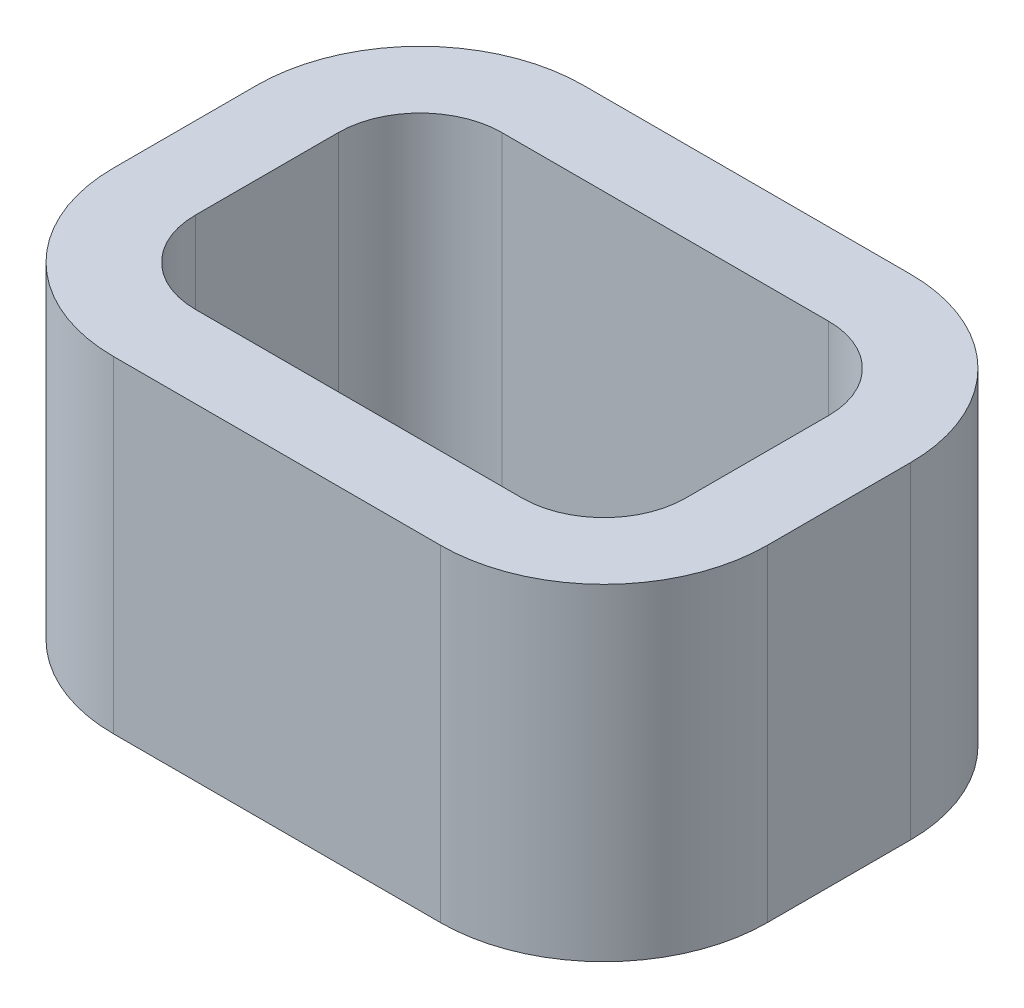
ISO-10303-21;
HEADER;
FILE_DESCRIPTION(('STEP AP214'),'2;1');
FILE_NAME('part.step','',(''),(''),'','','');
FILE_SCHEMA(('AUTOMOTIVE_DESIGN { 1 0 10303 214 1 1 1 1 }'));
ENDSEC;
DATA;
#1=APPLICATION_CONTEXT('core data for automotive mechanical design processes');
#2=APPLICATION_PROTOCOL_DEFINITION('international standard','automotive_design',2000,#1);
#3=PRODUCT_CONTEXT('',#1,'mechanical');
#4=PRODUCT('Part','Part','',(#3));
#5=PRODUCT_RELATED_PRODUCT_CATEGORY('part','',(#4));
#6=PRODUCT_DEFINITION_FORMATION('','',#4);
#7=PRODUCT_DEFINITION_CONTEXT('part definition',#1,'design');
#8=PRODUCT_DEFINITION('design','',#6,#7);
#9=PRODUCT_DEFINITION_SHAPE('','',#8);
#10=(LENGTH_UNIT() NAMED_UNIT(*) SI_UNIT(.MILLI.,.METRE.));
#11=(NAMED_UNIT(*) PLANE_ANGLE_UNIT() SI_UNIT($,.RADIAN.));
#12=(NAMED_UNIT(*) SI_UNIT($,.STERADIAN.) SOLID_ANGLE_UNIT());
#13=UNCERTAINTY_MEASURE_WITH_UNIT(LENGTH_MEASURE(1.E-05),#10,'distance_accuracy_value','');
#14=(GEOMETRIC_REPRESENTATION_CONTEXT(3) GLOBAL_UNCERTAINTY_ASSIGNED_CONTEXT((#13)) GLOBAL_UNIT_ASSIGNED_CONTEXT((#10,
#11,#12)) REPRESENTATION_CONTEXT('',''));
#15=CARTESIAN_POINT('',(0.,0.,0.));
#16=DIRECTION('',(0.,0.,1.));
#17=DIRECTION('',(1.,0.,0.));
#18=AXIS2_PLACEMENT_3D('',#15,#16,#17);
#19=CARTESIAN_POINT('',(-0.4,0.8,0.4));
#20=DIRECTION('',(0.,-1.,0.));
#21=DIRECTION('',(0.,0.,-1.));
#22=AXIS2_PLACEMENT_3D('',#19,#20,#21);
#23=CYLINDRICAL_SURFACE('',#22,0.4);
#24=CARTESIAN_POINT('',(-0.4,0.,0.4));
#25=DIRECTION('',(0.,1.,0.));
#26=DIRECTION('',(0.,0.,-1.));
#27=AXIS2_PLACEMENT_3D('',#24,#25,#26);
#28=CIRCLE('',#27,0.4);
#29=CARTESIAN_POINT('',(-0.4,0.,0.));
#30=VERTEX_POINT('',#29);
#31=CARTESIAN_POINT('',(-0.8,0.,0.4));
#32=VERTEX_POINT('',#31);
#33=EDGE_CURVE('E204',#30,#32,#28,.T.);
#34=ORIENTED_EDGE('',*,*,#33,.T.);
#35=DIRECTION('',(0.,-1.,0.));
#36=VECTOR('',#35,1.);
#37=CARTESIAN_POINT('',(-0.8,0.8,0.4));
#38=LINE('',#37,#36);
#39=CARTESIAN_POINT('',(-0.8,0.8,0.4));
#40=VERTEX_POINT('',#39);
#41=EDGE_CURVE('E42',#40,#32,#38,.T.);
#42=ORIENTED_EDGE('',*,*,#41,.F.);
#43=CARTESIAN_POINT('',(-0.4,0.8,0.4));
#44=DIRECTION('',(0.,1.,0.));
#45=DIRECTION('',(0.,0.,-1.));
#46=AXIS2_PLACEMENT_3D('',#43,#44,#45);
#47=CIRCLE('',#46,0.4);
#48=CARTESIAN_POINT('',(-0.4,0.8,0.));
#49=VERTEX_POINT('',#48);
#50=EDGE_CURVE('E219',#49,#40,#47,.T.);
#51=ORIENTED_EDGE('',*,*,#50,.F.);
#52=DIRECTION('',(0.,-1.,0.));
#53=VECTOR('',#52,1.);
#54=CARTESIAN_POINT('',(-0.4,0.8,0.));
#55=LINE('',#54,#53);
#56=EDGE_CURVE('E11',#49,#30,#55,.T.);
#57=ORIENTED_EDGE('',*,*,#56,.T.);
#58=EDGE_LOOP('',(#34,#42,#51,#57));
#59=FACE_BOUND('',#58,.T.);
#60=ADVANCED_FACE('F35',(#59),#23,.T.);
#61=CARTESIAN_POINT('',(-0.8,0.8,0.749999999999998));
#62=DIRECTION('',(1.,0.,0.));
#63=DIRECTION('',(0.,0.,-1.));
#64=AXIS2_PLACEMENT_3D('',#61,#62,#63);
#65=PLANE('',#64);
#66=DIRECTION('',(0.,0.,1.));
#67=VECTOR('',#66,1.);
#68=CARTESIAN_POINT('',(-0.8,0.,0.749999999999998));
#69=LINE('',#68,#67);
#70=CARTESIAN_POINT('',(-0.8,0.,0.749999999999998));
#71=VERTEX_POINT('',#70);
#72=EDGE_CURVE('E237',#32,#71,#69,.T.);
#73=ORIENTED_EDGE('',*,*,#72,.T.);
#74=DIRECTION('',(0.,-1.,0.));
#75=VECTOR('',#74,1.);
#76=CARTESIAN_POINT('',(-0.8,0.8,0.749999999999998));
#77=LINE('',#76,#75);
#78=CARTESIAN_POINT('',(-0.8,0.8,0.749999999999998));
#79=VERTEX_POINT('',#78);
#80=EDGE_CURVE('E264',#79,#71,#77,.T.);
#81=ORIENTED_EDGE('',*,*,#80,.F.);
#82=DIRECTION('',(0.,0.,1.));
#83=VECTOR('',#82,1.);
#84=CARTESIAN_POINT('',(-0.8,0.8,0.749999999999998));
#85=LINE('',#84,#83);
#86=EDGE_CURVE('E222',#40,#79,#85,.T.);
#87=ORIENTED_EDGE('',*,*,#86,.F.);
#88=ORIENTED_EDGE('',*,*,#41,.T.);
#89=EDGE_LOOP('',(#73,#81,#87,#88));
#90=FACE_BOUND('',#89,.T.);
#91=ADVANCED_FACE('F271',(#90),#65,.F.);
#92=CARTESIAN_POINT('',(-0.4,0.8,0.75));
#93=DIRECTION('',(0.,-1.,0.));
#94=DIRECTION('',(0.,0.,-1.));
#95=AXIS2_PLACEMENT_3D('',#92,#93,#94);
#96=CYLINDRICAL_SURFACE('',#95,0.4);
#97=CARTESIAN_POINT('',(-0.4,0.,0.75));
#98=DIRECTION('',(0.,1.,0.));
#99=DIRECTION('',(0.,0.,-1.));
#100=AXIS2_PLACEMENT_3D('',#97,#98,#99);
#101=CIRCLE('',#100,0.4);
#102=CARTESIAN_POINT('',(-0.399999999999997,0.,1.15));
#103=VERTEX_POINT('',#102);
#104=EDGE_CURVE('E239',#71,#103,#101,.T.);
#105=ORIENTED_EDGE('',*,*,#104,.T.);
#106=DIRECTION('',(0.,-1.,0.));
#107=VECTOR('',#106,1.);
#108=CARTESIAN_POINT('',(-0.399999999999997,0.8,1.15));
#109=LINE('',#108,#107);
#110=CARTESIAN_POINT('',(-0.399999999999997,0.8,1.15));
#111=VERTEX_POINT('',#110);
#112=EDGE_CURVE('E261',#111,#103,#109,.T.);
#113=ORIENTED_EDGE('',*,*,#112,.F.);
#114=CARTESIAN_POINT('',(-0.4,0.8,0.75));
#115=DIRECTION('',(0.,1.,0.));
#116=DIRECTION('',(0.,0.,-1.));
#117=AXIS2_PLACEMENT_3D('',#114,#115,#116);
#118=CIRCLE('',#117,0.4);
#119=EDGE_CURVE('E224',#79,#111,#118,.T.);
#120=ORIENTED_EDGE('',*,*,#119,.F.);
#121=ORIENTED_EDGE('',*,*,#80,.T.);
#122=EDGE_LOOP('',(#105,#113,#120,#121));
#123=FACE_BOUND('',#122,.T.);
#124=ADVANCED_FACE('F281',(#123),#96,.T.);
#125=CARTESIAN_POINT('',(0.4,0.8,1.15));
#126=DIRECTION('',(0.,0.,-1.));
#127=DIRECTION('',(-1.,0.,0.));
#128=AXIS2_PLACEMENT_3D('',#125,#126,#127);
#129=PLANE('',#128);
#130=DIRECTION('',(1.,0.,0.));
#131=VECTOR('',#130,1.);
#132=CARTESIAN_POINT('',(0.4,0.,1.15));
#133=LINE('',#132,#131);
#134=CARTESIAN_POINT('',(0.4,0.,1.15));
#135=VERTEX_POINT('',#134);
#136=EDGE_CURVE('E241',#103,#135,#133,.T.);
#137=ORIENTED_EDGE('',*,*,#136,.T.);
#138=DIRECTION('',(0.,-1.,0.));
#139=VECTOR('',#138,1.);
#140=CARTESIAN_POINT('',(0.4,0.8,1.15));
#141=LINE('',#140,#139);
#142=CARTESIAN_POINT('',(0.4,0.8,1.15));
#143=VERTEX_POINT('',#142);
#144=EDGE_CURVE('E258',#143,#135,#141,.T.);
#145=ORIENTED_EDGE('',*,*,#144,.F.);
#146=DIRECTION('',(1.,0.,0.));
#147=VECTOR('',#146,1.);
#148=CARTESIAN_POINT('',(0.4,0.8,1.15));
#149=LINE('',#148,#147);
#150=EDGE_CURVE('E226',#111,#143,#149,.T.);
#151=ORIENTED_EDGE('',*,*,#150,.F.);
#152=ORIENTED_EDGE('',*,*,#112,.T.);
#153=EDGE_LOOP('',(#137,#145,#151,#152));
#154=FACE_BOUND('',#153,.T.);
#155=ADVANCED_FACE('F285',(#154),#129,.F.);
#156=CARTESIAN_POINT('',(0.4,0.8,0.75));
#157=DIRECTION('',(0.,-1.,0.));
#158=DIRECTION('',(0.,0.,-1.));
#159=AXIS2_PLACEMENT_3D('',#156,#157,#158);
#160=CYLINDRICAL_SURFACE('',#159,0.4);
#161=CARTESIAN_POINT('',(0.4,0.,0.75));
#162=DIRECTION('',(0.,1.,0.));
#163=DIRECTION('',(0.,0.,1.));
#164=AXIS2_PLACEMENT_3D('',#161,#162,#163);
#165=CIRCLE('',#164,0.4);
#166=CARTESIAN_POINT('',(0.8,0.,0.75));
#167=VERTEX_POINT('',#166);
#168=EDGE_CURVE('E243',#135,#167,#165,.T.);
#169=ORIENTED_EDGE('',*,*,#168,.T.);
#170=DIRECTION('',(0.,-1.,0.));
#171=VECTOR('',#170,1.);
#172=CARTESIAN_POINT('',(0.8,0.8,0.75));
#173=LINE('',#172,#171);
#174=CARTESIAN_POINT('',(0.8,0.8,0.75));
#175=VERTEX_POINT('',#174);
#176=EDGE_CURVE('E255',#175,#167,#173,.T.);
#177=ORIENTED_EDGE('',*,*,#176,.F.);
#178=CARTESIAN_POINT('',(0.4,0.8,0.75));
#179=DIRECTION('',(0.,1.,0.));
#180=DIRECTION('',(0.,0.,1.));
#181=AXIS2_PLACEMENT_3D('',#178,#179,#180);
#182=CIRCLE('',#181,0.4);
#183=EDGE_CURVE('E228',#143,#175,#182,.T.);
#184=ORIENTED_EDGE('',*,*,#183,.F.);
#185=ORIENTED_EDGE('',*,*,#144,.T.);
#186=EDGE_LOOP('',(#169,#177,#184,#185));
#187=FACE_BOUND('',#186,.T.);
#188=ADVANCED_FACE('F305',(#187),#160,.T.);
#189=CARTESIAN_POINT('',(0.8,0.8,0.4));
#190=DIRECTION('',(-1.,0.,0.));
#191=DIRECTION('',(0.,0.,1.));
#192=AXIS2_PLACEMENT_3D('',#189,#190,#191);
#193=PLANE('',#192);
#194=DIRECTION('',(0.,0.,-1.));
#195=VECTOR('',#194,1.);
#196=CARTESIAN_POINT('',(0.8,0.,0.4));
#197=LINE('',#196,#195);
#198=CARTESIAN_POINT('',(0.8,0.,0.4));
#199=VERTEX_POINT('',#198);
#200=EDGE_CURVE('E245',#167,#199,#197,.T.);
#201=ORIENTED_EDGE('',*,*,#200,.T.);
#202=DIRECTION('',(0.,-1.,0.));
#203=VECTOR('',#202,1.);
#204=CARTESIAN_POINT('',(0.8,0.8,0.4));
#205=LINE('',#204,#203);
#206=CARTESIAN_POINT('',(0.8,0.8,0.4));
#207=VERTEX_POINT('',#206);
#208=EDGE_CURVE('E252',#207,#199,#205,.T.);
#209=ORIENTED_EDGE('',*,*,#208,.F.);
#210=DIRECTION('',(0.,0.,-1.));
#211=VECTOR('',#210,1.);
#212=CARTESIAN_POINT('',(0.8,0.8,0.4));
#213=LINE('',#212,#211);
#214=EDGE_CURVE('E230',#175,#207,#213,.T.);
#215=ORIENTED_EDGE('',*,*,#214,.F.);
#216=ORIENTED_EDGE('',*,*,#176,.T.);
#217=EDGE_LOOP('',(#201,#209,#215,#216));
#218=FACE_BOUND('',#217,.T.);
#219=ADVANCED_FACE('F303',(#218),#193,.F.);
#220=CARTESIAN_POINT('',(0.4,0.8,0.4));
#221=DIRECTION('',(0.,-1.,0.));
#222=DIRECTION('',(0.,0.,-1.));
#223=AXIS2_PLACEMENT_3D('',#220,#221,#222);
#224=CYLINDRICAL_SURFACE('',#223,0.4);
#225=CARTESIAN_POINT('',(0.4,0.,0.4));
#226=DIRECTION('',(0.,1.,0.));
#227=DIRECTION('',(0.,0.,1.));
#228=AXIS2_PLACEMENT_3D('',#225,#226,#227);
#229=CIRCLE('',#228,0.4);
#230=CARTESIAN_POINT('',(0.4,0.,0.));
#231=VERTEX_POINT('',#230);
#232=EDGE_CURVE('E247',#199,#231,#229,.T.);
#233=ORIENTED_EDGE('',*,*,#232,.T.);
#234=DIRECTION('',(0.,-1.,0.));
#235=VECTOR('',#234,1.);
#236=CARTESIAN_POINT('',(0.4,0.8,0.));
#237=LINE('',#236,#235);
#238=CARTESIAN_POINT('',(0.4,0.8,0.));
#239=VERTEX_POINT('',#238);
#240=EDGE_CURVE('E235',#239,#231,#237,.T.);
#241=ORIENTED_EDGE('',*,*,#240,.F.);
#242=CARTESIAN_POINT('',(0.4,0.8,0.4));
#243=DIRECTION('',(0.,1.,0.));
#244=DIRECTION('',(0.,0.,1.));
#245=AXIS2_PLACEMENT_3D('',#242,#243,#244);
#246=CIRCLE('',#245,0.4);
#247=EDGE_CURVE('E232',#207,#239,#246,.T.);
#248=ORIENTED_EDGE('',*,*,#247,.F.);
#249=ORIENTED_EDGE('',*,*,#208,.T.);
#250=EDGE_LOOP('',(#233,#241,#248,#249));
#251=FACE_BOUND('',#250,.T.);
#252=ADVANCED_FACE('F298',(#251),#224,.T.);
#253=CARTESIAN_POINT('',(0.,0.8,0.));
#254=DIRECTION('',(0.,0.,1.));
#255=DIRECTION('',(1.,0.,0.));
#256=AXIS2_PLACEMENT_3D('',#253,#254,#255);
#257=PLANE('',#256);
#258=DIRECTION('',(-1.,0.,0.));
#259=VECTOR('',#258,1.);
#260=CARTESIAN_POINT('',(0.,0.,0.));
#261=LINE('',#260,#259);
#262=EDGE_CURVE('E220',#231,#30,#261,.T.);
#263=ORIENTED_EDGE('',*,*,#262,.T.);
#264=ORIENTED_EDGE('',*,*,#56,.F.);
#265=DIRECTION('',(-1.,0.,0.));
#266=VECTOR('',#265,1.);
#267=CARTESIAN_POINT('',(-0.4,0.8,0.));
#268=LINE('',#267,#266);
#269=EDGE_CURVE('E216',#239,#49,#268,.T.);
#270=ORIENTED_EDGE('',*,*,#269,.F.);
#271=ORIENTED_EDGE('',*,*,#240,.T.);
#272=EDGE_LOOP('',(#263,#264,#270,#271));
#273=FACE_BOUND('',#272,.T.);
#274=ADVANCED_FACE('F293',(#273),#257,.F.);
#275=CARTESIAN_POINT('',(0.4,0.8,0.4));
#276=DIRECTION('',(0.,1.,0.));
#277=DIRECTION('',(0.,0.,1.));
#278=AXIS2_PLACEMENT_3D('',#275,#276,#277);
#279=PLANE('',#278);
#280=CARTESIAN_POINT('',(0.4,0.8,0.4));
#281=DIRECTION('',(0.,1.,0.));
#282=DIRECTION('',(0.,0.,-1.));
#283=AXIS2_PLACEMENT_3D('',#280,#281,#282);
#284=CIRCLE('',#283,0.2);
#285=CARTESIAN_POINT('',(0.6,0.8,0.400000000000002));
#286=VERTEX_POINT('',#285);
#287=CARTESIAN_POINT('',(0.399999999999998,0.8,0.2));
#288=VERTEX_POINT('',#287);
#289=EDGE_CURVE('E49',#286,#288,#284,.T.);
#290=ORIENTED_EDGE('',*,*,#289,.F.);
#291=DIRECTION('',(0.,0.,-1.));
#292=VECTOR('',#291,1.);
#293=CARTESIAN_POINT('',(0.6,0.8,0.400000000000002));
#294=LINE('',#293,#292);
#295=CARTESIAN_POINT('',(0.6,0.8,0.749999999999999));
#296=VERTEX_POINT('',#295);
#297=EDGE_CURVE('E166',#296,#286,#294,.T.);
#298=ORIENTED_EDGE('',*,*,#297,.F.);
#299=CARTESIAN_POINT('',(0.4,0.8,0.75));
#300=DIRECTION('',(0.,1.,0.));
#301=DIRECTION('',(0.,0.,-1.));
#302=AXIS2_PLACEMENT_3D('',#299,#300,#301);
#303=CIRCLE('',#302,0.2);
#304=CARTESIAN_POINT('',(0.399999999999998,0.8,0.95));
#305=VERTEX_POINT('',#304);
#306=EDGE_CURVE('E169',#305,#296,#303,.T.);
#307=ORIENTED_EDGE('',*,*,#306,.F.);
#308=DIRECTION('',(1.,0.,0.));
#309=VECTOR('',#308,1.);
#310=CARTESIAN_POINT('',(-0.399999999999999,0.8,0.95));
#311=LINE('',#310,#309);
#312=CARTESIAN_POINT('',(-0.399999999999999,0.8,0.95));
#313=VERTEX_POINT('',#312);
#314=EDGE_CURVE('E197',#313,#305,#311,.T.);
#315=ORIENTED_EDGE('',*,*,#314,.F.);
#316=CARTESIAN_POINT('',(-0.4,0.8,0.75));
#317=DIRECTION('',(0.,1.,0.));
#318=DIRECTION('',(0.,0.,-1.));
#319=AXIS2_PLACEMENT_3D('',#316,#317,#318);
#320=CIRCLE('',#319,0.2);
#321=CARTESIAN_POINT('',(-0.6,0.8,0.749999999999999));
#322=VERTEX_POINT('',#321);
#323=EDGE_CURVE('E194',#322,#313,#320,.T.);
#324=ORIENTED_EDGE('',*,*,#323,.F.);
#325=DIRECTION('',(0.,0.,1.));
#326=VECTOR('',#325,1.);
#327=CARTESIAN_POINT('',(-0.6,0.8,0.400000000000002));
#328=LINE('',#327,#326);
#329=CARTESIAN_POINT('',(-0.6,0.8,0.400000000000002));
#330=VERTEX_POINT('',#329);
#331=EDGE_CURVE('E191',#330,#322,#328,.T.);
#332=ORIENTED_EDGE('',*,*,#331,.F.);
#333=CARTESIAN_POINT('',(-0.4,0.8,0.4));
#334=DIRECTION('',(0.,1.,0.));
#335=DIRECTION('',(0.,0.,1.));
#336=AXIS2_PLACEMENT_3D('',#333,#334,#335);
#337=CIRCLE('',#336,0.2);
#338=CARTESIAN_POINT('',(-0.399999999999999,0.8,0.2));
#339=VERTEX_POINT('',#338);
#340=EDGE_CURVE('E188',#339,#330,#337,.T.);
#341=ORIENTED_EDGE('',*,*,#340,.F.);
#342=DIRECTION('',(-1.,0.,0.));
#343=VECTOR('',#342,1.);
#344=CARTESIAN_POINT('',(-0.399999999999999,0.8,0.2));
#345=LINE('',#344,#343);
#346=EDGE_CURVE('E186',#288,#339,#345,.T.);
#347=ORIENTED_EDGE('',*,*,#346,.F.);
#348=EDGE_LOOP('',(#290,#298,#307,#315,#324,#332,#341,#347));
#349=FACE_BOUND('',#348,.T.);
#350=ORIENTED_EDGE('',*,*,#269,.T.);
#351=ORIENTED_EDGE('',*,*,#50,.T.);
#352=ORIENTED_EDGE('',*,*,#86,.T.);
#353=ORIENTED_EDGE('',*,*,#119,.T.);
#354=ORIENTED_EDGE('',*,*,#150,.T.);
#355=ORIENTED_EDGE('',*,*,#183,.T.);
#356=ORIENTED_EDGE('',*,*,#214,.T.);
#357=ORIENTED_EDGE('',*,*,#247,.T.);
#358=EDGE_LOOP('',(#350,#351,#352,#353,#354,#355,#356,#357));
#359=FACE_BOUND('',#358,.T.);
#360=ADVANCED_FACE('F289',(#349,#359),#279,.T.);
#361=CARTESIAN_POINT('',(0.4,0.,0.4));
#362=DIRECTION('',(0.,1.,0.));
#363=DIRECTION('',(0.,0.,1.));
#364=AXIS2_PLACEMENT_3D('',#361,#362,#363);
#365=PLANE('',#364);
#366=DIRECTION('',(0.,0.,-1.));
#367=VECTOR('',#366,1.);
#368=CARTESIAN_POINT('',(0.6,0.,0.400000000000002));
#369=LINE('',#368,#367);
#370=CARTESIAN_POINT('',(0.6,0.,0.749999999999999));
#371=VERTEX_POINT('',#370);
#372=CARTESIAN_POINT('',(0.6,0.,0.400000000000002));
#373=VERTEX_POINT('',#372);
#374=EDGE_CURVE('E155',#371,#373,#369,.T.);
#375=ORIENTED_EDGE('',*,*,#374,.T.);
#376=CARTESIAN_POINT('',(0.4,0.,0.4));
#377=DIRECTION('',(0.,1.,0.));
#378=DIRECTION('',(0.,0.,-1.));
#379=AXIS2_PLACEMENT_3D('',#376,#377,#378);
#380=CIRCLE('',#379,0.2);
#381=CARTESIAN_POINT('',(0.399999999999998,0.,0.2));
#382=VERTEX_POINT('',#381);
#383=EDGE_CURVE('E149',#373,#382,#380,.T.);
#384=ORIENTED_EDGE('',*,*,#383,.T.);
#385=DIRECTION('',(-1.,0.,0.));
#386=VECTOR('',#385,1.);
#387=CARTESIAN_POINT('',(-0.399999999999999,0.,0.2));
#388=LINE('',#387,#386);
#389=CARTESIAN_POINT('',(-0.399999999999999,0.,0.2));
#390=VERTEX_POINT('',#389);
#391=EDGE_CURVE('E158',#382,#390,#388,.T.);
#392=ORIENTED_EDGE('',*,*,#391,.T.);
#393=CARTESIAN_POINT('',(-0.4,0.,0.4));
#394=DIRECTION('',(0.,1.,0.));
#395=DIRECTION('',(0.,0.,1.));
#396=AXIS2_PLACEMENT_3D('',#393,#394,#395);
#397=CIRCLE('',#396,0.2);
#398=CARTESIAN_POINT('',(-0.6,0.,0.400000000000002));
#399=VERTEX_POINT('',#398);
#400=EDGE_CURVE('E57',#390,#399,#397,.T.);
#401=ORIENTED_EDGE('',*,*,#400,.T.);
#402=DIRECTION('',(0.,0.,1.));
#403=VECTOR('',#402,1.);
#404=CARTESIAN_POINT('',(-0.6,0.,0.400000000000002));
#405=LINE('',#404,#403);
#406=CARTESIAN_POINT('',(-0.6,0.,0.749999999999999));
#407=VERTEX_POINT('',#406);
#408=EDGE_CURVE('E173',#399,#407,#405,.T.);
#409=ORIENTED_EDGE('',*,*,#408,.T.);
#410=CARTESIAN_POINT('',(-0.4,0.,0.75));
#411=DIRECTION('',(0.,1.,0.));
#412=DIRECTION('',(0.,0.,-1.));
#413=AXIS2_PLACEMENT_3D('',#410,#411,#412);
#414=CIRCLE('',#413,0.2);
#415=CARTESIAN_POINT('',(-0.399999999999999,0.,0.95));
#416=VERTEX_POINT('',#415);
#417=EDGE_CURVE('E176',#407,#416,#414,.T.);
#418=ORIENTED_EDGE('',*,*,#417,.T.);
#419=DIRECTION('',(1.,0.,0.));
#420=VECTOR('',#419,1.);
#421=CARTESIAN_POINT('',(-0.399999999999999,0.,0.95));
#422=LINE('',#421,#420);
#423=CARTESIAN_POINT('',(0.399999999999998,0.,0.95));
#424=VERTEX_POINT('',#423);
#425=EDGE_CURVE('E179',#416,#424,#422,.T.);
#426=ORIENTED_EDGE('',*,*,#425,.T.);
#427=CARTESIAN_POINT('',(0.4,0.,0.75));
#428=DIRECTION('',(0.,1.,0.));
#429=DIRECTION('',(0.,0.,-1.));
#430=AXIS2_PLACEMENT_3D('',#427,#428,#429);
#431=CIRCLE('',#430,0.2);
#432=EDGE_CURVE('E182',#424,#371,#431,.T.);
#433=ORIENTED_EDGE('',*,*,#432,.T.);
#434=EDGE_LOOP('',(#375,#384,#392,#401,#409,#418,#426,#433));
#435=FACE_BOUND('',#434,.T.);
#436=ORIENTED_EDGE('',*,*,#33,.F.);
#437=ORIENTED_EDGE('',*,*,#262,.F.);
#438=ORIENTED_EDGE('',*,*,#232,.F.);
#439=ORIENTED_EDGE('',*,*,#200,.F.);
#440=ORIENTED_EDGE('',*,*,#168,.F.);
#441=ORIENTED_EDGE('',*,*,#136,.F.);
#442=ORIENTED_EDGE('',*,*,#104,.F.);
#443=ORIENTED_EDGE('',*,*,#72,.F.);
#444=EDGE_LOOP('',(#436,#437,#438,#439,#440,#441,#442,#443));
#445=FACE_BOUND('',#444,.T.);
#446=ADVANCED_FACE('F162',(#435,#445),#365,.F.);
#447=CARTESIAN_POINT('',(0.4,0.,0.4));
#448=DIRECTION('',(0.,1.,0.));
#449=DIRECTION('',(0.,0.,1.));
#450=AXIS2_PLACEMENT_3D('',#447,#448,#449);
#451=CYLINDRICAL_SURFACE('',#450,0.2);
#452=ORIENTED_EDGE('',*,*,#289,.T.);
#453=DIRECTION('',(0.,1.,0.));
#454=VECTOR('',#453,1.);
#455=CARTESIAN_POINT('',(0.399999999999998,0.,0.2));
#456=LINE('',#455,#454);
#457=EDGE_CURVE('E145',#382,#288,#456,.T.);
#458=ORIENTED_EDGE('',*,*,#457,.F.);
#459=ORIENTED_EDGE('',*,*,#383,.F.);
#460=DIRECTION('',(0.,1.,0.));
#461=VECTOR('',#460,1.);
#462=CARTESIAN_POINT('',(0.6,0.,0.400000000000002));
#463=LINE('',#462,#461);
#464=EDGE_CURVE('E202',#373,#286,#463,.T.);
#465=ORIENTED_EDGE('',*,*,#464,.T.);
#466=EDGE_LOOP('',(#452,#458,#459,#465));
#467=FACE_BOUND('',#466,.T.);
#468=ADVANCED_FACE('F147',(#467),#451,.F.);
#469=CARTESIAN_POINT('',(0.6,0.,0.400000000000002));
#470=DIRECTION('',(1.,0.,0.));
#471=DIRECTION('',(0.,0.,-1.));
#472=AXIS2_PLACEMENT_3D('',#469,#470,#471);
#473=PLANE('',#472);
#474=ORIENTED_EDGE('',*,*,#297,.T.);
#475=ORIENTED_EDGE('',*,*,#464,.F.);
#476=ORIENTED_EDGE('',*,*,#374,.F.);
#477=DIRECTION('',(0.,1.,0.));
#478=VECTOR('',#477,1.);
#479=CARTESIAN_POINT('',(0.6,0.,0.749999999999999));
#480=LINE('',#479,#478);
#481=EDGE_CURVE('E205',#371,#296,#480,.T.);
#482=ORIENTED_EDGE('',*,*,#481,.T.);
#483=EDGE_LOOP('',(#474,#475,#476,#482));
#484=FACE_BOUND('',#483,.T.);
#485=ADVANCED_FACE('F381',(#484),#473,.F.);
#486=CARTESIAN_POINT('',(0.4,0.,0.75));
#487=DIRECTION('',(0.,1.,0.));
#488=DIRECTION('',(0.,0.,1.));
#489=AXIS2_PLACEMENT_3D('',#486,#487,#488);
#490=CYLINDRICAL_SURFACE('',#489,0.2);
#491=ORIENTED_EDGE('',*,*,#306,.T.);
#492=ORIENTED_EDGE('',*,*,#481,.F.);
#493=ORIENTED_EDGE('',*,*,#432,.F.);
#494=DIRECTION('',(0.,1.,0.));
#495=VECTOR('',#494,1.);
#496=CARTESIAN_POINT('',(0.399999999999998,0.,0.95));
#497=LINE('',#496,#495);
#498=EDGE_CURVE('E207',#424,#305,#497,.T.);
#499=ORIENTED_EDGE('',*,*,#498,.T.);
#500=EDGE_LOOP('',(#491,#492,#493,#499));
#501=FACE_BOUND('',#500,.T.);
#502=ADVANCED_FACE('F390',(#501),#490,.F.);
#503=CARTESIAN_POINT('',(-0.399999999999999,0.,0.95));
#504=DIRECTION('',(0.,0.,1.));
#505=DIRECTION('',(1.,0.,0.));
#506=AXIS2_PLACEMENT_3D('',#503,#504,#505);
#507=PLANE('',#506);
#508=ORIENTED_EDGE('',*,*,#314,.T.);
#509=ORIENTED_EDGE('',*,*,#498,.F.);
#510=ORIENTED_EDGE('',*,*,#425,.F.);
#511=DIRECTION('',(0.,1.,0.));
#512=VECTOR('',#511,1.);
#513=CARTESIAN_POINT('',(-0.399999999999999,0.,0.95));
#514=LINE('',#513,#512);
#515=EDGE_CURVE('E209',#416,#313,#514,.T.);
#516=ORIENTED_EDGE('',*,*,#515,.T.);
#517=EDGE_LOOP('',(#508,#509,#510,#516));
#518=FACE_BOUND('',#517,.T.);
#519=ADVANCED_FACE('F400',(#518),#507,.F.);
#520=CARTESIAN_POINT('',(-0.4,0.,0.75));
#521=DIRECTION('',(0.,1.,0.));
#522=DIRECTION('',(0.,0.,1.));
#523=AXIS2_PLACEMENT_3D('',#520,#521,#522);
#524=CYLINDRICAL_SURFACE('',#523,0.2);
#525=ORIENTED_EDGE('',*,*,#323,.T.);
#526=ORIENTED_EDGE('',*,*,#515,.F.);
#527=ORIENTED_EDGE('',*,*,#417,.F.);
#528=DIRECTION('',(0.,1.,0.));
#529=VECTOR('',#528,1.);
#530=CARTESIAN_POINT('',(-0.6,0.,0.749999999999999));
#531=LINE('',#530,#529);
#532=EDGE_CURVE('E211',#407,#322,#531,.T.);
#533=ORIENTED_EDGE('',*,*,#532,.T.);
#534=EDGE_LOOP('',(#525,#526,#527,#533));
#535=FACE_BOUND('',#534,.T.);
#536=ADVANCED_FACE('F410',(#535),#524,.F.);
#537=CARTESIAN_POINT('',(-0.6,0.,0.400000000000002));
#538=DIRECTION('',(-1.,0.,0.));
#539=DIRECTION('',(0.,0.,1.));
#540=AXIS2_PLACEMENT_3D('',#537,#538,#539);
#541=PLANE('',#540);
#542=ORIENTED_EDGE('',*,*,#331,.T.);
#543=ORIENTED_EDGE('',*,*,#532,.F.);
#544=ORIENTED_EDGE('',*,*,#408,.F.);
#545=DIRECTION('',(0.,1.,0.));
#546=VECTOR('',#545,1.);
#547=CARTESIAN_POINT('',(-0.6,0.,0.400000000000002));
#548=LINE('',#547,#546);
#549=EDGE_CURVE('E213',#399,#330,#548,.T.);
#550=ORIENTED_EDGE('',*,*,#549,.T.);
#551=EDGE_LOOP('',(#542,#543,#544,#550));
#552=FACE_BOUND('',#551,.T.);
#553=ADVANCED_FACE('F420',(#552),#541,.F.);
#554=CARTESIAN_POINT('',(-0.4,0.,0.4));
#555=DIRECTION('',(0.,1.,0.));
#556=DIRECTION('',(0.,0.,1.));
#557=AXIS2_PLACEMENT_3D('',#554,#555,#556);
#558=CYLINDRICAL_SURFACE('',#557,0.2);
#559=ORIENTED_EDGE('',*,*,#340,.T.);
#560=ORIENTED_EDGE('',*,*,#549,.F.);
#561=ORIENTED_EDGE('',*,*,#400,.F.);
#562=DIRECTION('',(0.,1.,0.));
#563=VECTOR('',#562,1.);
#564=CARTESIAN_POINT('',(-0.399999999999999,0.,0.2));
#565=LINE('',#564,#563);
#566=EDGE_CURVE('E154',#390,#339,#565,.T.);
#567=ORIENTED_EDGE('',*,*,#566,.T.);
#568=EDGE_LOOP('',(#559,#560,#561,#567));
#569=FACE_BOUND('',#568,.T.);
#570=ADVANCED_FACE('F430',(#569),#558,.F.);
#571=CARTESIAN_POINT('',(-0.399999999999999,0.,0.2));
#572=DIRECTION('',(0.,0.,-1.));
#573=DIRECTION('',(-1.,0.,0.));
#574=AXIS2_PLACEMENT_3D('',#571,#572,#573);
#575=PLANE('',#574);
#576=ORIENTED_EDGE('',*,*,#346,.T.);
#577=ORIENTED_EDGE('',*,*,#566,.F.);
#578=ORIENTED_EDGE('',*,*,#391,.F.);
#579=ORIENTED_EDGE('',*,*,#457,.T.);
#580=EDGE_LOOP('',(#576,#577,#578,#579));
#581=FACE_BOUND('',#580,.T.);
#582=ADVANCED_FACE('F159',(#581),#575,.F.);
#583=CLOSED_SHELL('',(#60,#91,#124,#155,#188,#219,#252,#274,#360,#446,#468,#485,#502,#519,#536,
#553,#570,#582));
#584=MANIFOLD_SOLID_BREP('B2',#583);
#585=ADVANCED_BREP_SHAPE_REPRESENTATION('',(#18,#584),#14);
#586=SHAPE_DEFINITION_REPRESENTATION(#9,#585);
ENDSEC;
END-ISO-10303-21;
